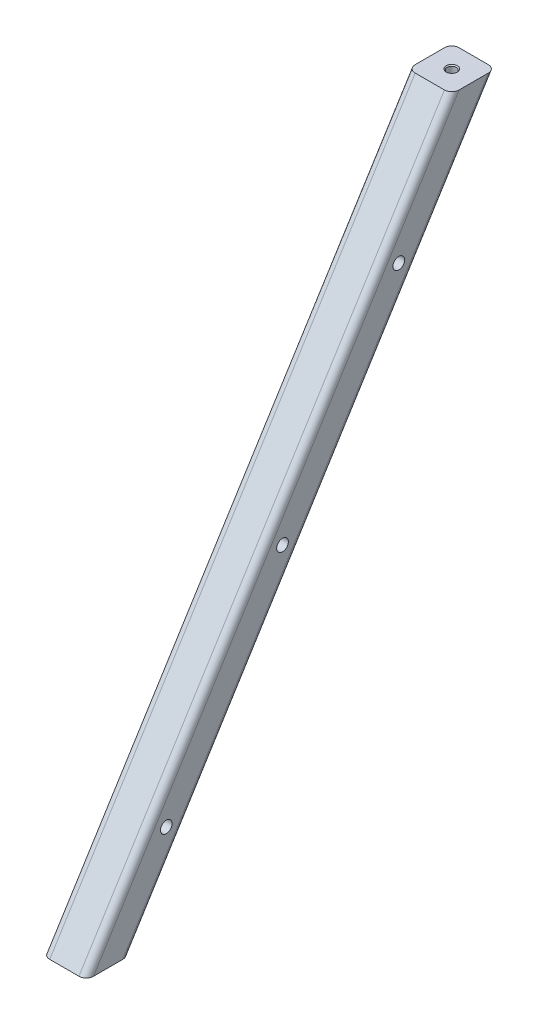
ISO-10303-21;
HEADER;
FILE_DESCRIPTION(('STEP AP214'),'2;1');
FILE_NAME('part.step','',(''),(''),'','','');
FILE_SCHEMA(('AUTOMOTIVE_DESIGN { 1 0 10303 214 1 1 1 1 }'));
ENDSEC;
DATA;
#1=APPLICATION_CONTEXT('core data for automotive mechanical design processes');
#2=APPLICATION_PROTOCOL_DEFINITION('international standard','automotive_design',2000,#1);
#3=PRODUCT_CONTEXT('',#1,'mechanical');
#4=PRODUCT('Part','Part','',(#3));
#5=PRODUCT_RELATED_PRODUCT_CATEGORY('part','',(#4));
#6=PRODUCT_DEFINITION_FORMATION('','',#4);
#7=PRODUCT_DEFINITION_CONTEXT('part definition',#1,'design');
#8=PRODUCT_DEFINITION('design','',#6,#7);
#9=PRODUCT_DEFINITION_SHAPE('','',#8);
#10=(LENGTH_UNIT() NAMED_UNIT(*) SI_UNIT(.MILLI.,.METRE.));
#11=(NAMED_UNIT(*) PLANE_ANGLE_UNIT() SI_UNIT($,.RADIAN.));
#12=(NAMED_UNIT(*) SI_UNIT($,.STERADIAN.) SOLID_ANGLE_UNIT());
#13=UNCERTAINTY_MEASURE_WITH_UNIT(LENGTH_MEASURE(1.E-05),#10,'distance_accuracy_value','');
#14=(GEOMETRIC_REPRESENTATION_CONTEXT(3) GLOBAL_UNCERTAINTY_ASSIGNED_CONTEXT((#13)) GLOBAL_UNIT_ASSIGNED_CONTEXT((#10,
#11,#12)) REPRESENTATION_CONTEXT('',''));
#15=CARTESIAN_POINT('',(0.,0.,0.));
#16=DIRECTION('',(0.,0.,1.));
#17=DIRECTION('',(1.,0.,0.));
#18=AXIS2_PLACEMENT_3D('',#15,#16,#17);
#19=CARTESIAN_POINT('',(4.,0.,-4.));
#20=DIRECTION('',(0.,-1.,0.));
#21=DIRECTION('',(0.,0.,-1.));
#22=AXIS2_PLACEMENT_3D('',#19,#20,#21);
#23=PLANE('',#22);
#24=CARTESIAN_POINT('',(0.,0.,0.));
#25=DIRECTION('',(0.,-1.,0.));
#26=DIRECTION('',(0.,0.,-1.));
#27=AXIS2_PLACEMENT_3D('',#24,#25,#26);
#28=CIRCLE('',#27,1.525);
#29=CARTESIAN_POINT('',(0.,0.,-1.525));
#30=VERTEX_POINT('',#29);
#31=EDGE_CURVE('E128',#30,#30,#28,.T.);
#32=ORIENTED_EDGE('',*,*,#31,.F.);
#33=EDGE_LOOP('',(#32));
#34=FACE_BOUND('',#33,.T.);
#35=CARTESIAN_POINT('',(4.,0.,-4.));
#36=DIRECTION('',(0.,1.,0.));
#37=DIRECTION('',(0.,0.,-1.));
#38=AXIS2_PLACEMENT_3D('',#35,#36,#37);
#39=CIRCLE('',#38,2.);
#40=CARTESIAN_POINT('',(6.,0.,-4.));
#41=VERTEX_POINT('',#40);
#42=CARTESIAN_POINT('',(4.,0.,-6.));
#43=VERTEX_POINT('',#42);
#44=EDGE_CURVE('E76',#41,#43,#39,.T.);
#45=ORIENTED_EDGE('',*,*,#44,.F.);
#46=DIRECTION('',(0.,0.,-1.));
#47=VECTOR('',#46,1.);
#48=CARTESIAN_POINT('',(6.,0.,-4.));
#49=LINE('',#48,#47);
#50=CARTESIAN_POINT('',(6.,0.,4.));
#51=VERTEX_POINT('',#50);
#52=EDGE_CURVE('E82',#51,#41,#49,.T.);
#53=ORIENTED_EDGE('',*,*,#52,.F.);
#54=CARTESIAN_POINT('',(4.,0.,4.));
#55=DIRECTION('',(0.,1.,0.));
#56=DIRECTION('',(0.,0.,1.));
#57=AXIS2_PLACEMENT_3D('',#54,#55,#56);
#58=CIRCLE('',#57,2.);
#59=CARTESIAN_POINT('',(4.,0.,6.));
#60=VERTEX_POINT('',#59);
#61=EDGE_CURVE('E90',#60,#51,#58,.T.);
#62=ORIENTED_EDGE('',*,*,#61,.F.);
#63=DIRECTION('',(1.,0.,0.));
#64=VECTOR('',#63,1.);
#65=CARTESIAN_POINT('',(-4.,0.,6.));
#66=LINE('',#65,#64);
#67=CARTESIAN_POINT('',(-4.,0.,6.));
#68=VERTEX_POINT('',#67);
#69=EDGE_CURVE('E180',#68,#60,#66,.T.);
#70=ORIENTED_EDGE('',*,*,#69,.F.);
#71=CARTESIAN_POINT('',(-4.,0.,4.));
#72=DIRECTION('',(0.,1.,0.));
#73=DIRECTION('',(0.,0.,1.));
#74=AXIS2_PLACEMENT_3D('',#71,#72,#73);
#75=CIRCLE('',#74,2.);
#76=CARTESIAN_POINT('',(-6.,0.,4.));
#77=VERTEX_POINT('',#76);
#78=EDGE_CURVE('E166',#77,#68,#75,.T.);
#79=ORIENTED_EDGE('',*,*,#78,.F.);
#80=DIRECTION('',(0.,0.,1.));
#81=VECTOR('',#80,1.);
#82=CARTESIAN_POINT('',(-6.,0.,-4.));
#83=LINE('',#82,#81);
#84=CARTESIAN_POINT('',(-6.,0.,-4.));
#85=VERTEX_POINT('',#84);
#86=EDGE_CURVE('E161',#85,#77,#83,.T.);
#87=ORIENTED_EDGE('',*,*,#86,.F.);
#88=CARTESIAN_POINT('',(-4.,0.,-4.));
#89=DIRECTION('',(0.,1.,0.));
#90=DIRECTION('',(0.,0.,1.));
#91=AXIS2_PLACEMENT_3D('',#88,#89,#90);
#92=CIRCLE('',#91,2.);
#93=CARTESIAN_POINT('',(-4.,0.,-6.));
#94=VERTEX_POINT('',#93);
#95=EDGE_CURVE('E149',#94,#85,#92,.T.);
#96=ORIENTED_EDGE('',*,*,#95,.F.);
#97=DIRECTION('',(-1.,0.,0.));
#98=VECTOR('',#97,1.);
#99=CARTESIAN_POINT('',(-4.,0.,-6.));
#100=LINE('',#99,#98);
#101=EDGE_CURVE('E148',#43,#94,#100,.T.);
#102=ORIENTED_EDGE('',*,*,#101,.F.);
#103=EDGE_LOOP('',(#45,#53,#62,#70,#79,#87,#96,#102));
#104=FACE_BOUND('',#103,.T.);
#105=ADVANCED_FACE('F50',(#34,#104),#23,.T.);
#106=CARTESIAN_POINT('',(4.,160.,-104.));
#107=DIRECTION('',(0.,-1.,0.));
#108=DIRECTION('',(0.,0.,-1.));
#109=AXIS2_PLACEMENT_3D('',#106,#107,#108);
#110=PLANE('',#109);
#111=CARTESIAN_POINT('',(0.,160.,-100.));
#112=DIRECTION('',(0.,1.,0.));
#113=DIRECTION('',(0.,0.,1.));
#114=AXIS2_PLACEMENT_3D('',#111,#112,#113);
#115=CIRCLE('',#114,1.525);
#116=CARTESIAN_POINT('',(0.,160.,-98.475));
#117=VERTEX_POINT('',#116);
#118=EDGE_CURVE('E140',#117,#117,#115,.T.);
#119=ORIENTED_EDGE('',*,*,#118,.F.);
#120=EDGE_LOOP('',(#119));
#121=FACE_BOUND('',#120,.T.);
#122=CARTESIAN_POINT('',(4.,160.,-104.));
#123=DIRECTION('',(0.,1.,0.));
#124=DIRECTION('',(0.,0.,-1.));
#125=AXIS2_PLACEMENT_3D('',#122,#123,#124);
#126=CIRCLE('',#125,2.);
#127=CARTESIAN_POINT('',(6.,160.,-104.));
#128=VERTEX_POINT('',#127);
#129=CARTESIAN_POINT('',(4.,160.,-106.));
#130=VERTEX_POINT('',#129);
#131=EDGE_CURVE('E11',#128,#130,#126,.T.);
#132=ORIENTED_EDGE('',*,*,#131,.T.);
#133=DIRECTION('',(-1.,0.,0.));
#134=VECTOR('',#133,1.);
#135=CARTESIAN_POINT('',(-4.,160.,-106.));
#136=LINE('',#135,#134);
#137=CARTESIAN_POINT('',(-4.,160.,-106.));
#138=VERTEX_POINT('',#137);
#139=EDGE_CURVE('E147',#130,#138,#136,.T.);
#140=ORIENTED_EDGE('',*,*,#139,.T.);
#141=CARTESIAN_POINT('',(-4.,160.,-104.));
#142=DIRECTION('',(0.,1.,0.));
#143=DIRECTION('',(0.,0.,1.));
#144=AXIS2_PLACEMENT_3D('',#141,#142,#143);
#145=CIRCLE('',#144,2.);
#146=CARTESIAN_POINT('',(-6.,160.,-104.));
#147=VERTEX_POINT('',#146);
#148=EDGE_CURVE('E156',#138,#147,#145,.T.);
#149=ORIENTED_EDGE('',*,*,#148,.T.);
#150=DIRECTION('',(0.,0.,1.));
#151=VECTOR('',#150,1.);
#152=CARTESIAN_POINT('',(-6.,160.,-104.));
#153=LINE('',#152,#151);
#154=CARTESIAN_POINT('',(-6.,160.,-96.));
#155=VERTEX_POINT('',#154);
#156=EDGE_CURVE('E167',#147,#155,#153,.T.);
#157=ORIENTED_EDGE('',*,*,#156,.T.);
#158=CARTESIAN_POINT('',(-4.,160.,-96.));
#159=DIRECTION('',(0.,1.,0.));
#160=DIRECTION('',(0.,0.,1.));
#161=AXIS2_PLACEMENT_3D('',#158,#159,#160);
#162=CIRCLE('',#161,2.);
#163=CARTESIAN_POINT('',(-4.,160.,-94.));
#164=VERTEX_POINT('',#163);
#165=EDGE_CURVE('E174',#155,#164,#162,.T.);
#166=ORIENTED_EDGE('',*,*,#165,.T.);
#167=DIRECTION('',(1.,0.,0.));
#168=VECTOR('',#167,1.);
#169=CARTESIAN_POINT('',(-4.,160.,-94.));
#170=LINE('',#169,#168);
#171=CARTESIAN_POINT('',(4.,160.,-94.));
#172=VERTEX_POINT('',#171);
#173=EDGE_CURVE('E185',#164,#172,#170,.T.);
#174=ORIENTED_EDGE('',*,*,#173,.T.);
#175=CARTESIAN_POINT('',(4.,160.,-96.));
#176=DIRECTION('',(0.,1.,0.));
#177=DIRECTION('',(0.,0.,1.));
#178=AXIS2_PLACEMENT_3D('',#175,#176,#177);
#179=CIRCLE('',#178,2.);
#180=CARTESIAN_POINT('',(6.,160.,-96.));
#181=VERTEX_POINT('',#180);
#182=EDGE_CURVE('E66',#172,#181,#179,.T.);
#183=ORIENTED_EDGE('',*,*,#182,.T.);
#184=DIRECTION('',(0.,0.,-1.));
#185=VECTOR('',#184,1.);
#186=CARTESIAN_POINT('',(6.,160.,-104.));
#187=LINE('',#186,#185);
#188=EDGE_CURVE('E58',#181,#128,#187,.T.);
#189=ORIENTED_EDGE('',*,*,#188,.T.);
#190=EDGE_LOOP('',(#132,#140,#149,#157,#166,#174,#183,#189));
#191=FACE_BOUND('',#190,.T.);
#192=ADVANCED_FACE('F202',(#121,#191),#110,.F.);
#193=CARTESIAN_POINT('',(-4.,0.,-6.));
#194=DIRECTION('',(0.,-0.52999894000318,-0.847998304005088));
#195=DIRECTION('',(0.,0.847998304005088,-0.52999894000318));
#196=AXIS2_PLACEMENT_3D('',#193,#194,#195);
#197=PLANE('',#196);
#198=DIRECTION('',(0.,0.847998304005088,-0.52999894000318));
#199=VECTOR('',#198,1.);
#200=CARTESIAN_POINT('',(-4.,0.,-6.));
#201=LINE('',#200,#199);
#202=EDGE_CURVE('E155',#94,#138,#201,.T.);
#203=ORIENTED_EDGE('',*,*,#202,.T.);
#204=ORIENTED_EDGE('',*,*,#139,.F.);
#205=DIRECTION('',(0.,0.847998304005088,-0.52999894000318));
#206=VECTOR('',#205,1.);
#207=CARTESIAN_POINT('',(4.,0.,-6.));
#208=LINE('',#207,#206);
#209=EDGE_CURVE('E153',#43,#130,#208,.T.);
#210=ORIENTED_EDGE('',*,*,#209,.F.);
#211=ORIENTED_EDGE('',*,*,#101,.T.);
#212=EDGE_LOOP('',(#203,#204,#210,#211));
#213=FACE_BOUND('',#212,.T.);
#214=ADVANCED_FACE('F205',(#213),#197,.T.);
#215=CARTESIAN_POINT('',(-4.,0.,-6.));
#216=CARTESIAN_POINT('',(-4.,160.,-106.));
#217=CARTESIAN_POINT('',(-5.17157287525381,0.,-6.));
#218=CARTESIAN_POINT('',(-5.17157287525381,160.,-106.));
#219=CARTESIAN_POINT('',(-6.,0.,-5.17157287525381));
#220=CARTESIAN_POINT('',(-6.,160.,-105.171572875254));
#221=CARTESIAN_POINT('',(-6.,0.,-4.));
#222=CARTESIAN_POINT('',(-6.,160.,-104.));
#223=(BOUNDED_SURFACE() B_SPLINE_SURFACE(3,1,((#215,#216),(#217,#218),(#219,#220),(#221,#222)),
.UNSPECIFIED.,.F.,.F.,.F.) B_SPLINE_SURFACE_WITH_KNOTS((4,4),(2,2),(0.,1.),(0.,1.),
.UNSPECIFIED.) GEOMETRIC_REPRESENTATION_ITEM() RATIONAL_B_SPLINE_SURFACE(((1.,1.),
(0.804737854124365,0.804737854124365),(0.804737854124365,0.804737854124365),(1.,1.))) REPRESENTATION_ITEM('') SURFACE());
#224=DIRECTION('',(0.,0.847998304005088,-0.52999894000318));
#225=VECTOR('',#224,1.);
#226=CARTESIAN_POINT('',(-6.,0.,-4.));
#227=LINE('',#226,#225);
#228=EDGE_CURVE('E162',#85,#147,#227,.T.);
#229=ORIENTED_EDGE('',*,*,#228,.T.);
#230=ORIENTED_EDGE('',*,*,#148,.F.);
#231=ORIENTED_EDGE('',*,*,#202,.F.);
#232=ORIENTED_EDGE('',*,*,#95,.T.);
#233=EDGE_LOOP('',(#229,#230,#231,#232));
#234=FACE_BOUND('',#233,.T.);
#235=ADVANCED_FACE('F208',(#234),#223,.T.);
#236=CARTESIAN_POINT('',(-6.,0.,-4.));
#237=DIRECTION('',(-1.,0.,0.));
#238=DIRECTION('',(0.,0.,1.));
#239=AXIS2_PLACEMENT_3D('',#236,#237,#238);
#240=PLANE('',#239);
#241=CARTESIAN_POINT('',(-6.,25.4399491201526,-15.8999682000954));
#242=DIRECTION('',(-1.,0.,0.));
#243=DIRECTION('',(0.,0.,1.));
#244=AXIS2_PLACEMENT_3D('',#241,#242,#243);
#245=CIRCLE('',#244,1.6);
#246=CARTESIAN_POINT('',(-6.,25.4399491201526,-14.2999682000954));
#247=VERTEX_POINT('',#246);
#248=EDGE_CURVE('E262',#247,#247,#245,.F.);
#249=ORIENTED_EDGE('',*,*,#248,.T.);
#250=EDGE_LOOP('',(#249));
#251=FACE_BOUND('',#250,.T.);
#252=CARTESIAN_POINT('',(-6.,76.3198473604579,-47.6999046002862));
#253=DIRECTION('',(-1.,0.,0.));
#254=DIRECTION('',(0.,0.,1.));
#255=AXIS2_PLACEMENT_3D('',#252,#253,#254);
#256=CIRCLE('',#255,1.60000000000001);
#257=CARTESIAN_POINT('',(-6.,76.3198473604579,-46.0999046002862));
#258=VERTEX_POINT('',#257);
#259=EDGE_CURVE('E277',#258,#258,#256,.F.);
#260=ORIENTED_EDGE('',*,*,#259,.T.);
#261=EDGE_LOOP('',(#260));
#262=FACE_BOUND('',#261,.T.);
#263=CARTESIAN_POINT('',(-6.,127.199745600763,-79.499841000477));
#264=DIRECTION('',(-1.,0.,0.));
#265=DIRECTION('',(0.,0.,1.));
#266=AXIS2_PLACEMENT_3D('',#263,#264,#265);
#267=CIRCLE('',#266,1.60000000000001);
#268=CARTESIAN_POINT('',(-6.,127.199745600763,-77.899841000477));
#269=VERTEX_POINT('',#268);
#270=EDGE_CURVE('E269',#269,#269,#267,.F.);
#271=ORIENTED_EDGE('',*,*,#270,.T.);
#272=EDGE_LOOP('',(#271));
#273=FACE_BOUND('',#272,.T.);
#274=DIRECTION('',(0.,0.847998304005088,-0.52999894000318));
#275=VECTOR('',#274,1.);
#276=CARTESIAN_POINT('',(-6.,0.,4.));
#277=LINE('',#276,#275);
#278=EDGE_CURVE('E173',#77,#155,#277,.T.);
#279=ORIENTED_EDGE('',*,*,#278,.T.);
#280=ORIENTED_EDGE('',*,*,#156,.F.);
#281=ORIENTED_EDGE('',*,*,#228,.F.);
#282=ORIENTED_EDGE('',*,*,#86,.T.);
#283=EDGE_LOOP('',(#279,#280,#281,#282));
#284=FACE_BOUND('',#283,.T.);
#285=ADVANCED_FACE('F211',(#251,#262,#273,#284),#240,.T.);
#286=CARTESIAN_POINT('',(-6.,0.,4.));
#287=CARTESIAN_POINT('',(-6.,160.,-96.));
#288=CARTESIAN_POINT('',(-6.,0.,5.17157287525381));
#289=CARTESIAN_POINT('',(-6.,160.,-94.8284271247462));
#290=CARTESIAN_POINT('',(-5.17157287525381,0.,6.));
#291=CARTESIAN_POINT('',(-5.17157287525381,160.,-94.));
#292=CARTESIAN_POINT('',(-4.,0.,6.));
#293=CARTESIAN_POINT('',(-4.,160.,-94.));
#294=(BOUNDED_SURFACE() B_SPLINE_SURFACE(3,1,((#286,#287),(#288,#289),(#290,#291),(#292,#293)),
.UNSPECIFIED.,.F.,.F.,.F.) B_SPLINE_SURFACE_WITH_KNOTS((4,4),(2,2),(0.,1.),(0.,1.),
.UNSPECIFIED.) GEOMETRIC_REPRESENTATION_ITEM() RATIONAL_B_SPLINE_SURFACE(((1.,1.),
(0.804737854124365,0.804737854124365),(0.804737854124365,0.804737854124365),(1.,1.))) REPRESENTATION_ITEM('') SURFACE());
#295=DIRECTION('',(0.,0.847998304005088,-0.52999894000318));
#296=VECTOR('',#295,1.);
#297=CARTESIAN_POINT('',(-4.,0.,6.));
#298=LINE('',#297,#296);
#299=EDGE_CURVE('E177',#68,#164,#298,.T.);
#300=ORIENTED_EDGE('',*,*,#299,.T.);
#301=ORIENTED_EDGE('',*,*,#165,.F.);
#302=ORIENTED_EDGE('',*,*,#278,.F.);
#303=ORIENTED_EDGE('',*,*,#78,.T.);
#304=EDGE_LOOP('',(#300,#301,#302,#303));
#305=FACE_BOUND('',#304,.T.);
#306=ADVANCED_FACE('F216',(#305),#294,.T.);
#307=CARTESIAN_POINT('',(-4.,0.,6.));
#308=DIRECTION('',(0.,0.52999894000318,0.847998304005088));
#309=DIRECTION('',(0.,-0.847998304005088,0.52999894000318));
#310=AXIS2_PLACEMENT_3D('',#307,#308,#309);
#311=PLANE('',#310);
#312=DIRECTION('',(0.,0.847998304005088,-0.52999894000318));
#313=VECTOR('',#312,1.);
#314=CARTESIAN_POINT('',(4.,0.,6.));
#315=LINE('',#314,#313);
#316=EDGE_CURVE('E183',#60,#172,#315,.T.);
#317=ORIENTED_EDGE('',*,*,#316,.T.);
#318=ORIENTED_EDGE('',*,*,#173,.F.);
#319=ORIENTED_EDGE('',*,*,#299,.F.);
#320=ORIENTED_EDGE('',*,*,#69,.T.);
#321=EDGE_LOOP('',(#317,#318,#319,#320));
#322=FACE_BOUND('',#321,.T.);
#323=ADVANCED_FACE('F218',(#322),#311,.T.);
#324=CARTESIAN_POINT('',(4.,0.,6.));
#325=CARTESIAN_POINT('',(4.,160.,-94.));
#326=CARTESIAN_POINT('',(5.17157287525381,0.,6.));
#327=CARTESIAN_POINT('',(5.17157287525381,160.,-94.));
#328=CARTESIAN_POINT('',(6.,0.,5.17157287525381));
#329=CARTESIAN_POINT('',(6.,160.,-94.8284271247462));
#330=CARTESIAN_POINT('',(6.,0.,4.));
#331=CARTESIAN_POINT('',(6.,160.,-96.));
#332=(BOUNDED_SURFACE() B_SPLINE_SURFACE(3,1,((#324,#325),(#326,#327),(#328,#329),(#330,#331)),
.UNSPECIFIED.,.F.,.F.,.F.) B_SPLINE_SURFACE_WITH_KNOTS((4,4),(2,2),(0.,1.),(0.,1.),
.UNSPECIFIED.) GEOMETRIC_REPRESENTATION_ITEM() RATIONAL_B_SPLINE_SURFACE(((1.,1.),
(0.804737854124365,0.804737854124365),(0.804737854124365,0.804737854124365),(1.,1.))) REPRESENTATION_ITEM('') SURFACE());
#333=DIRECTION('',(0.,0.847998304005088,-0.52999894000318));
#334=VECTOR('',#333,1.);
#335=CARTESIAN_POINT('',(6.,0.,4.));
#336=LINE('',#335,#334);
#337=EDGE_CURVE('E187',#51,#181,#336,.T.);
#338=ORIENTED_EDGE('',*,*,#337,.T.);
#339=ORIENTED_EDGE('',*,*,#182,.F.);
#340=ORIENTED_EDGE('',*,*,#316,.F.);
#341=ORIENTED_EDGE('',*,*,#61,.T.);
#342=EDGE_LOOP('',(#338,#339,#340,#341));
#343=FACE_BOUND('',#342,.T.);
#344=ADVANCED_FACE('F225',(#343),#332,.T.);
#345=CARTESIAN_POINT('',(6.,0.,-4.));
#346=DIRECTION('',(1.,0.,0.));
#347=DIRECTION('',(0.,0.,-1.));
#348=AXIS2_PLACEMENT_3D('',#345,#346,#347);
#349=PLANE('',#348);
#350=CARTESIAN_POINT('',(6.,25.4399491201526,-15.8999682000954));
#351=DIRECTION('',(1.,0.,0.));
#352=DIRECTION('',(0.,0.,-1.));
#353=AXIS2_PLACEMENT_3D('',#350,#351,#352);
#354=CIRCLE('',#353,1.6);
#355=CARTESIAN_POINT('',(6.,25.4399491201526,-17.4999682000954));
#356=VERTEX_POINT('',#355);
#357=EDGE_CURVE('E265',#356,#356,#354,.T.);
#358=ORIENTED_EDGE('',*,*,#357,.F.);
#359=EDGE_LOOP('',(#358));
#360=FACE_BOUND('',#359,.T.);
#361=CARTESIAN_POINT('',(6.,76.3198473604579,-47.6999046002862));
#362=DIRECTION('',(1.,0.,0.));
#363=DIRECTION('',(0.,0.,-1.));
#364=AXIS2_PLACEMENT_3D('',#361,#362,#363);
#365=CIRCLE('',#364,1.60000000000001);
#366=CARTESIAN_POINT('',(6.,76.3198473604579,-49.2999046002862));
#367=VERTEX_POINT('',#366);
#368=EDGE_CURVE('E272',#367,#367,#365,.T.);
#369=ORIENTED_EDGE('',*,*,#368,.F.);
#370=EDGE_LOOP('',(#369));
#371=FACE_BOUND('',#370,.T.);
#372=CARTESIAN_POINT('',(6.,127.199745600763,-79.499841000477));
#373=DIRECTION('',(1.,0.,0.));
#374=DIRECTION('',(0.,0.,-1.));
#375=AXIS2_PLACEMENT_3D('',#372,#373,#374);
#376=CIRCLE('',#375,1.60000000000001);
#377=CARTESIAN_POINT('',(6.,127.199745600763,-81.099841000477));
#378=VERTEX_POINT('',#377);
#379=EDGE_CURVE('E270',#378,#378,#376,.T.);
#380=ORIENTED_EDGE('',*,*,#379,.F.);
#381=EDGE_LOOP('',(#380));
#382=FACE_BOUND('',#381,.T.);
#383=DIRECTION('',(0.,0.847998304005088,-0.52999894000318));
#384=VECTOR('',#383,1.);
#385=CARTESIAN_POINT('',(6.,0.,-4.));
#386=LINE('',#385,#384);
#387=EDGE_CURVE('E53',#41,#128,#386,.T.);
#388=ORIENTED_EDGE('',*,*,#387,.T.);
#389=ORIENTED_EDGE('',*,*,#188,.F.);
#390=ORIENTED_EDGE('',*,*,#337,.F.);
#391=ORIENTED_EDGE('',*,*,#52,.T.);
#392=EDGE_LOOP('',(#388,#389,#390,#391));
#393=FACE_BOUND('',#392,.T.);
#394=ADVANCED_FACE('F223',(#360,#371,#382,#393),#349,.T.);
#395=CARTESIAN_POINT('',(6.,0.,-4.));
#396=CARTESIAN_POINT('',(6.,160.,-104.));
#397=CARTESIAN_POINT('',(6.,0.,-5.17157287525381));
#398=CARTESIAN_POINT('',(6.,160.,-105.171572875254));
#399=CARTESIAN_POINT('',(5.17157287525381,0.,-6.));
#400=CARTESIAN_POINT('',(5.17157287525381,160.,-106.));
#401=CARTESIAN_POINT('',(4.,0.,-6.));
#402=CARTESIAN_POINT('',(4.,160.,-106.));
#403=(BOUNDED_SURFACE() B_SPLINE_SURFACE(3,1,((#395,#396),(#397,#398),(#399,#400),(#401,#402)),
.UNSPECIFIED.,.F.,.F.,.F.) B_SPLINE_SURFACE_WITH_KNOTS((4,4),(2,2),(0.,1.),(0.,1.),
.UNSPECIFIED.) GEOMETRIC_REPRESENTATION_ITEM() RATIONAL_B_SPLINE_SURFACE(((1.,1.),
(0.804737854124365,0.804737854124365),(0.804737854124365,0.804737854124365),(1.,1.))) REPRESENTATION_ITEM('') SURFACE());
#404=ORIENTED_EDGE('',*,*,#131,.F.);
#405=ORIENTED_EDGE('',*,*,#387,.F.);
#406=ORIENTED_EDGE('',*,*,#44,.T.);
#407=ORIENTED_EDGE('',*,*,#209,.T.);
#408=EDGE_LOOP('',(#404,#405,#406,#407));
#409=FACE_BOUND('',#408,.T.);
#410=ADVANCED_FACE('F200',(#409),#403,.T.);
#411=CARTESIAN_POINT('',(0.,5.24892422621555,0.));
#412=DIRECTION('',(0.,-1.,0.));
#413=DIRECTION('',(0.,0.,-1.));
#414=AXIS2_PLACEMENT_3D('',#411,#412,#413);
#415=CONICAL_SURFACE('',#414,1.25,1.02974425867665);
#416=CARTESIAN_POINT('',(0.,6.,0.));
#417=VERTEX_POINT('',#416);
#418=VERTEX_LOOP('',#417);
#419=FACE_BOUND('',#418,.T.);
#420=CARTESIAN_POINT('',(0.,5.24892422621555,0.));
#421=DIRECTION('',(0.,-1.,0.));
#422=DIRECTION('',(0.,0.,-1.));
#423=AXIS2_PLACEMENT_3D('',#420,#421,#422);
#424=CIRCLE('',#423,1.25);
#425=CARTESIAN_POINT('',(0.,5.24892422621555,-1.25));
#426=VERTEX_POINT('',#425);
#427=EDGE_CURVE('E141',#426,#426,#424,.T.);
#428=ORIENTED_EDGE('',*,*,#427,.T.);
#429=EDGE_LOOP('',(#428));
#430=FACE_BOUND('',#429,.T.);
#431=ADVANCED_FACE('F232',(#419,#430),#415,.F.);
#432=CARTESIAN_POINT('',(0.,0.,0.));
#433=DIRECTION('',(0.,-1.,0.));
#434=DIRECTION('',(0.,0.,-1.));
#435=AXIS2_PLACEMENT_3D('',#432,#433,#434);
#436=CYLINDRICAL_SURFACE('',#435,1.25);
#437=ORIENTED_EDGE('',*,*,#427,.F.);
#438=EDGE_LOOP('',(#437));
#439=FACE_BOUND('',#438,.T.);
#440=CARTESIAN_POINT('',(0.,0.275000000000001,0.));
#441=DIRECTION('',(0.,-1.,0.));
#442=DIRECTION('',(0.,0.,-1.));
#443=AXIS2_PLACEMENT_3D('',#440,#441,#442);
#444=CIRCLE('',#443,1.25);
#445=CARTESIAN_POINT('',(0.,0.275000000000001,-1.25));
#446=VERTEX_POINT('',#445);
#447=EDGE_CURVE('E134',#446,#446,#444,.T.);
#448=ORIENTED_EDGE('',*,*,#447,.T.);
#449=EDGE_LOOP('',(#448));
#450=FACE_BOUND('',#449,.T.);
#451=ADVANCED_FACE('F304',(#439,#450),#436,.F.);
#452=CARTESIAN_POINT('',(0.,0.,0.));
#453=DIRECTION('',(0.,-1.,0.));
#454=DIRECTION('',(0.,0.,-1.));
#455=AXIS2_PLACEMENT_3D('',#452,#453,#454);
#456=CONICAL_SURFACE('',#455,1.525,0.785398163397447);
#457=ORIENTED_EDGE('',*,*,#447,.F.);
#458=EDGE_LOOP('',(#457));
#459=FACE_BOUND('',#458,.T.);
#460=ORIENTED_EDGE('',*,*,#31,.T.);
#461=EDGE_LOOP('',(#460));
#462=FACE_BOUND('',#461,.T.);
#463=ADVANCED_FACE('F122',(#459,#462),#456,.F.);
#464=CARTESIAN_POINT('',(0.,154.751075773784,-100.));
#465=DIRECTION('',(0.,1.,0.));
#466=DIRECTION('',(0.,0.,1.));
#467=AXIS2_PLACEMENT_3D('',#464,#465,#466);
#468=CONICAL_SURFACE('',#467,1.25,1.02974425867666);
#469=CARTESIAN_POINT('',(0.,154.,-100.));
#470=VERTEX_POINT('',#469);
#471=VERTEX_LOOP('',#470);
#472=FACE_BOUND('',#471,.T.);
#473=CARTESIAN_POINT('',(0.,154.751075773784,-100.));
#474=DIRECTION('',(0.,1.,0.));
#475=DIRECTION('',(0.,0.,1.));
#476=AXIS2_PLACEMENT_3D('',#473,#474,#475);
#477=CIRCLE('',#476,1.25);
#478=CARTESIAN_POINT('',(0.,154.751075773784,-98.75));
#479=VERTEX_POINT('',#478);
#480=EDGE_CURVE('E126',#479,#479,#477,.T.);
#481=ORIENTED_EDGE('',*,*,#480,.T.);
#482=EDGE_LOOP('',(#481));
#483=FACE_BOUND('',#482,.T.);
#484=ADVANCED_FACE('F117',(#472,#483),#468,.F.);
#485=CARTESIAN_POINT('',(0.,160.,-100.));
#486=DIRECTION('',(0.,1.,0.));
#487=DIRECTION('',(0.,0.,1.));
#488=AXIS2_PLACEMENT_3D('',#485,#486,#487);
#489=CYLINDRICAL_SURFACE('',#488,1.24999999999999);
#490=ORIENTED_EDGE('',*,*,#480,.F.);
#491=EDGE_LOOP('',(#490));
#492=FACE_BOUND('',#491,.T.);
#493=CARTESIAN_POINT('',(0.,159.725,-100.));
#494=DIRECTION('',(0.,1.,0.));
#495=DIRECTION('',(0.,0.,1.));
#496=AXIS2_PLACEMENT_3D('',#493,#494,#495);
#497=CIRCLE('',#496,1.24999999999999);
#498=CARTESIAN_POINT('',(0.,159.725,-98.75));
#499=VERTEX_POINT('',#498);
#500=EDGE_CURVE('E133',#499,#499,#497,.T.);
#501=ORIENTED_EDGE('',*,*,#500,.T.);
#502=EDGE_LOOP('',(#501));
#503=FACE_BOUND('',#502,.T.);
#504=ADVANCED_FACE('F123',(#492,#503),#489,.F.);
#505=CARTESIAN_POINT('',(0.,160.,-100.));
#506=DIRECTION('',(0.,1.,0.));
#507=DIRECTION('',(0.,0.,1.));
#508=AXIS2_PLACEMENT_3D('',#505,#506,#507);
#509=CONICAL_SURFACE('',#508,1.525,0.785398163397474);
#510=ORIENTED_EDGE('',*,*,#500,.F.);
#511=EDGE_LOOP('',(#510));
#512=FACE_BOUND('',#511,.T.);
#513=ORIENTED_EDGE('',*,*,#118,.T.);
#514=EDGE_LOOP('',(#513));
#515=FACE_BOUND('',#514,.T.);
#516=ADVANCED_FACE('F300',(#512,#515),#509,.F.);
#517=CARTESIAN_POINT('',(-6.00100000000001,127.199745600763,-79.499841000477));
#518=DIRECTION('',(1.,0.,0.));
#519=DIRECTION('',(0.,0.,-1.));
#520=AXIS2_PLACEMENT_3D('',#517,#518,#519);
#521=CYLINDRICAL_SURFACE('',#520,1.60000000000001);
#522=ORIENTED_EDGE('',*,*,#270,.F.);
#523=EDGE_LOOP('',(#522));
#524=FACE_BOUND('',#523,.T.);
#525=ORIENTED_EDGE('',*,*,#379,.T.);
#526=EDGE_LOOP('',(#525));
#527=FACE_BOUND('',#526,.T.);
#528=ADVANCED_FACE('F295',(#524,#527),#521,.F.);
#529=CARTESIAN_POINT('',(-6.00100000000001,76.3198473604579,-47.6999046002862));
#530=DIRECTION('',(1.,0.,0.));
#531=DIRECTION('',(0.,0.,-1.));
#532=AXIS2_PLACEMENT_3D('',#529,#530,#531);
#533=CYLINDRICAL_SURFACE('',#532,1.60000000000001);
#534=ORIENTED_EDGE('',*,*,#259,.F.);
#535=EDGE_LOOP('',(#534));
#536=FACE_BOUND('',#535,.T.);
#537=ORIENTED_EDGE('',*,*,#368,.T.);
#538=EDGE_LOOP('',(#537));
#539=FACE_BOUND('',#538,.T.);
#540=ADVANCED_FACE('F290',(#536,#539),#533,.F.);
#541=CARTESIAN_POINT('',(-6.00100000000001,25.4399491201526,-15.8999682000954));
#542=DIRECTION('',(1.,0.,0.));
#543=DIRECTION('',(0.,0.,-1.));
#544=AXIS2_PLACEMENT_3D('',#541,#542,#543);
#545=CYLINDRICAL_SURFACE('',#544,1.6);
#546=ORIENTED_EDGE('',*,*,#248,.F.);
#547=EDGE_LOOP('',(#546));
#548=FACE_BOUND('',#547,.T.);
#549=ORIENTED_EDGE('',*,*,#357,.T.);
#550=EDGE_LOOP('',(#549));
#551=FACE_BOUND('',#550,.T.);
#552=ADVANCED_FACE('F284',(#548,#551),#545,.F.);
#553=CLOSED_SHELL('',(#105,#192,#214,#235,#285,#306,#323,#344,#394,#410,#431,#451,#463,#484,
#504,#516,#528,#540,#552));
#554=MANIFOLD_SOLID_BREP('B2',#553);
#555=ADVANCED_BREP_SHAPE_REPRESENTATION('',(#18,#554),#14);
#556=SHAPE_DEFINITION_REPRESENTATION(#9,#555);
ENDSEC;
END-ISO-10303-21;
